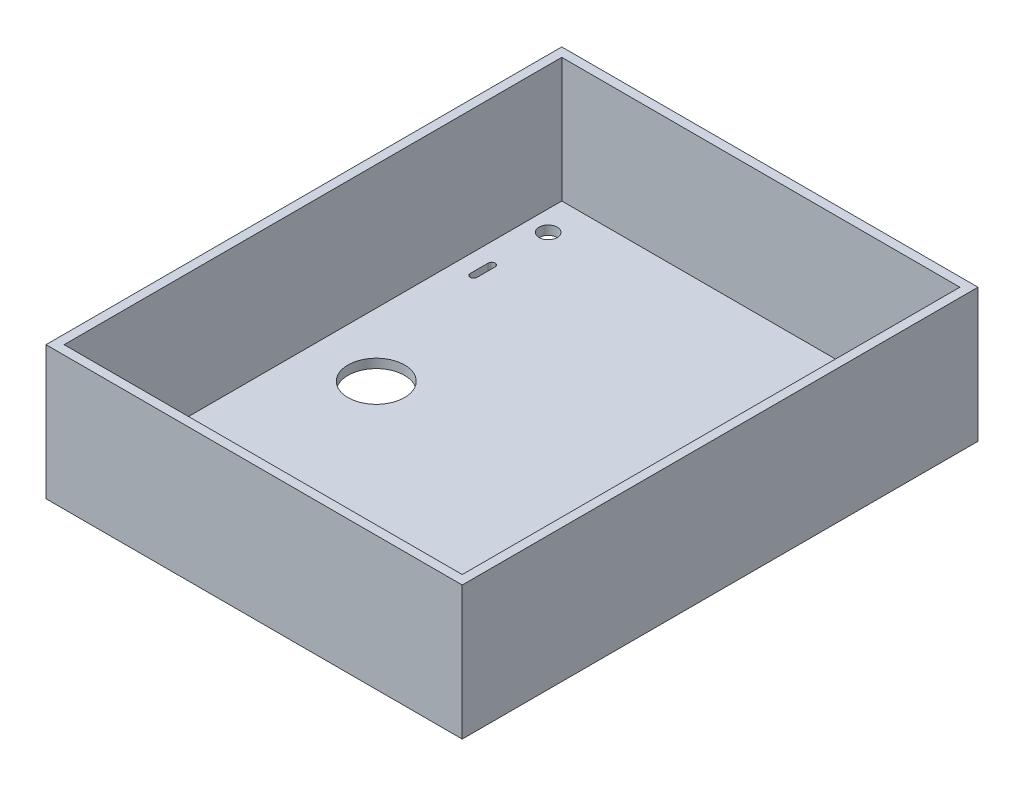
ISO-10303-21;
HEADER;
FILE_DESCRIPTION(('STEP AP214'),'2;1');
FILE_NAME('part.step','',(''),(''),'','','');
FILE_SCHEMA(('AUTOMOTIVE_DESIGN { 1 0 10303 214 1 1 1 1 }'));
ENDSEC;
DATA;
#1=APPLICATION_CONTEXT('core data for automotive mechanical design processes');
#2=APPLICATION_PROTOCOL_DEFINITION('international standard','automotive_design',2000,#1);
#3=PRODUCT_CONTEXT('',#1,'mechanical');
#4=PRODUCT('Part','Part','',(#3));
#5=PRODUCT_RELATED_PRODUCT_CATEGORY('part','',(#4));
#6=PRODUCT_DEFINITION_FORMATION('','',#4);
#7=PRODUCT_DEFINITION_CONTEXT('part definition',#1,'design');
#8=PRODUCT_DEFINITION('design','',#6,#7);
#9=PRODUCT_DEFINITION_SHAPE('','',#8);
#10=(LENGTH_UNIT() NAMED_UNIT(*) SI_UNIT(.MILLI.,.METRE.));
#11=(NAMED_UNIT(*) PLANE_ANGLE_UNIT() SI_UNIT($,.RADIAN.));
#12=(NAMED_UNIT(*) SI_UNIT($,.STERADIAN.) SOLID_ANGLE_UNIT());
#13=UNCERTAINTY_MEASURE_WITH_UNIT(LENGTH_MEASURE(1.E-05),#10,'distance_accuracy_value','');
#14=(GEOMETRIC_REPRESENTATION_CONTEXT(3) GLOBAL_UNCERTAINTY_ASSIGNED_CONTEXT((#13)) GLOBAL_UNIT_ASSIGNED_CONTEXT((#10,
#11,#12)) REPRESENTATION_CONTEXT('',''));
#15=CARTESIAN_POINT('',(0.,0.,0.));
#16=DIRECTION('',(0.,0.,1.));
#17=DIRECTION('',(1.,0.,0.));
#18=AXIS2_PLACEMENT_3D('',#15,#16,#17);
#19=CARTESIAN_POINT('',(92.,59.,-114.));
#20=DIRECTION('',(-1.,0.,0.));
#21=DIRECTION('',(0.,0.,1.));
#22=AXIS2_PLACEMENT_3D('',#19,#20,#21);
#23=PLANE('',#22);
#24=DIRECTION('',(0.,0.,-1.));
#25=VECTOR('',#24,1.);
#26=CARTESIAN_POINT('',(92.,0.,-114.));
#27=LINE('',#26,#25);
#28=CARTESIAN_POINT('',(92.,0.,114.));
#29=VERTEX_POINT('',#28);
#30=CARTESIAN_POINT('',(92.,0.,-114.));
#31=VERTEX_POINT('',#30);
#32=EDGE_CURVE('E381',#29,#31,#27,.T.);
#33=ORIENTED_EDGE('',*,*,#32,.T.);
#34=DIRECTION('',(0.,-1.,0.));
#35=VECTOR('',#34,1.);
#36=CARTESIAN_POINT('',(92.,59.,-114.));
#37=LINE('',#36,#35);
#38=CARTESIAN_POINT('',(92.,59.,-114.));
#39=VERTEX_POINT('',#38);
#40=EDGE_CURVE('E11',#39,#31,#37,.T.);
#41=ORIENTED_EDGE('',*,*,#40,.F.);
#42=DIRECTION('',(0.,0.,-1.));
#43=VECTOR('',#42,1.);
#44=CARTESIAN_POINT('',(92.,59.,-114.));
#45=LINE('',#44,#43);
#46=CARTESIAN_POINT('',(92.,59.,114.));
#47=VERTEX_POINT('',#46);
#48=EDGE_CURVE('E388',#47,#39,#45,.T.);
#49=ORIENTED_EDGE('',*,*,#48,.F.);
#50=DIRECTION('',(0.,-1.,0.));
#51=VECTOR('',#50,1.);
#52=CARTESIAN_POINT('',(92.,59.,114.));
#53=LINE('',#52,#51);
#54=EDGE_CURVE('E398',#47,#29,#53,.T.);
#55=ORIENTED_EDGE('',*,*,#54,.T.);
#56=EDGE_LOOP('',(#33,#41,#49,#55));
#57=FACE_BOUND('',#56,.T.);
#58=ADVANCED_FACE('F33',(#57),#23,.F.);
#59=CARTESIAN_POINT('',(-92.,59.,-114.));
#60=DIRECTION('',(0.,0.,1.));
#61=DIRECTION('',(1.,0.,0.));
#62=AXIS2_PLACEMENT_3D('',#59,#60,#61);
#63=PLANE('',#62);
#64=DIRECTION('',(-1.,0.,0.));
#65=VECTOR('',#64,1.);
#66=CARTESIAN_POINT('',(-92.,0.,-114.));
#67=LINE('',#66,#65);
#68=CARTESIAN_POINT('',(-92.,0.,-114.));
#69=VERTEX_POINT('',#68);
#70=EDGE_CURVE('E401',#31,#69,#67,.T.);
#71=ORIENTED_EDGE('',*,*,#70,.T.);
#72=DIRECTION('',(0.,-1.,0.));
#73=VECTOR('',#72,1.);
#74=CARTESIAN_POINT('',(-92.,59.,-114.));
#75=LINE('',#74,#73);
#76=CARTESIAN_POINT('',(-92.,59.,-114.));
#77=VERTEX_POINT('',#76);
#78=EDGE_CURVE('E40',#77,#69,#75,.T.);
#79=ORIENTED_EDGE('',*,*,#78,.F.);
#80=DIRECTION('',(-1.,0.,0.));
#81=VECTOR('',#80,1.);
#82=CARTESIAN_POINT('',(-92.,59.,-114.));
#83=LINE('',#82,#81);
#84=EDGE_CURVE('E391',#39,#77,#83,.T.);
#85=ORIENTED_EDGE('',*,*,#84,.F.);
#86=ORIENTED_EDGE('',*,*,#40,.T.);
#87=EDGE_LOOP('',(#71,#79,#85,#86));
#88=FACE_BOUND('',#87,.T.);
#89=ADVANCED_FACE('F430',(#88),#63,.F.);
#90=CARTESIAN_POINT('',(-92.,59.,-114.));
#91=DIRECTION('',(1.,0.,0.));
#92=DIRECTION('',(0.,0.,-1.));
#93=AXIS2_PLACEMENT_3D('',#90,#91,#92);
#94=PLANE('',#93);
#95=DIRECTION('',(0.,0.,1.));
#96=VECTOR('',#95,1.);
#97=CARTESIAN_POINT('',(-92.,0.,-114.));
#98=LINE('',#97,#96);
#99=CARTESIAN_POINT('',(-92.,0.,114.));
#100=VERTEX_POINT('',#99);
#101=EDGE_CURVE('E403',#69,#100,#98,.T.);
#102=ORIENTED_EDGE('',*,*,#101,.T.);
#103=DIRECTION('',(0.,-1.,0.));
#104=VECTOR('',#103,1.);
#105=CARTESIAN_POINT('',(-92.,59.,114.));
#106=LINE('',#105,#104);
#107=CARTESIAN_POINT('',(-92.,59.,114.));
#108=VERTEX_POINT('',#107);
#109=EDGE_CURVE('E408',#108,#100,#106,.T.);
#110=ORIENTED_EDGE('',*,*,#109,.F.);
#111=DIRECTION('',(0.,0.,1.));
#112=VECTOR('',#111,1.);
#113=CARTESIAN_POINT('',(-92.,59.,-114.));
#114=LINE('',#113,#112);
#115=EDGE_CURVE('E394',#77,#108,#114,.T.);
#116=ORIENTED_EDGE('',*,*,#115,.F.);
#117=ORIENTED_EDGE('',*,*,#78,.T.);
#118=EDGE_LOOP('',(#102,#110,#116,#117));
#119=FACE_BOUND('',#118,.T.);
#120=ADVANCED_FACE('F415',(#119),#94,.F.);
#121=CARTESIAN_POINT('',(-92.,59.,114.));
#122=DIRECTION('',(0.,0.,-1.));
#123=DIRECTION('',(-1.,0.,0.));
#124=AXIS2_PLACEMENT_3D('',#121,#122,#123);
#125=PLANE('',#124);
#126=DIRECTION('',(1.,0.,0.));
#127=VECTOR('',#126,1.);
#128=CARTESIAN_POINT('',(-92.,0.,114.));
#129=LINE('',#128,#127);
#130=EDGE_CURVE('E392',#100,#29,#129,.T.);
#131=ORIENTED_EDGE('',*,*,#130,.T.);
#132=ORIENTED_EDGE('',*,*,#54,.F.);
#133=DIRECTION('',(1.,0.,0.));
#134=VECTOR('',#133,1.);
#135=CARTESIAN_POINT('',(-92.,59.,114.));
#136=LINE('',#135,#134);
#137=EDGE_CURVE('E396',#108,#47,#136,.T.);
#138=ORIENTED_EDGE('',*,*,#137,.F.);
#139=ORIENTED_EDGE('',*,*,#109,.T.);
#140=EDGE_LOOP('',(#131,#132,#138,#139));
#141=FACE_BOUND('',#140,.T.);
#142=ADVANCED_FACE('F423',(#141),#125,.F.);
#143=CARTESIAN_POINT('',(0.,59.,0.));
#144=DIRECTION('',(0.,1.,0.));
#145=DIRECTION('',(0.,0.,1.));
#146=AXIS2_PLACEMENT_3D('',#143,#144,#145);
#147=PLANE('',#146);
#148=DIRECTION('',(0.,0.,-1.));
#149=VECTOR('',#148,1.);
#150=CARTESIAN_POINT('',(88.,59.,-110.));
#151=LINE('',#150,#149);
#152=CARTESIAN_POINT('',(88.,59.,110.));
#153=VERTEX_POINT('',#152);
#154=CARTESIAN_POINT('',(88.,59.,-110.));
#155=VERTEX_POINT('',#154);
#156=EDGE_CURVE('E353',#153,#155,#151,.T.);
#157=ORIENTED_EDGE('',*,*,#156,.F.);
#158=DIRECTION('',(1.,0.,0.));
#159=VECTOR('',#158,1.);
#160=CARTESIAN_POINT('',(-88.,59.,110.));
#161=LINE('',#160,#159);
#162=CARTESIAN_POINT('',(-88.,59.,110.));
#163=VERTEX_POINT('',#162);
#164=EDGE_CURVE('E360',#163,#153,#161,.T.);
#165=ORIENTED_EDGE('',*,*,#164,.F.);
#166=DIRECTION('',(0.,0.,1.));
#167=VECTOR('',#166,1.);
#168=CARTESIAN_POINT('',(-88.,59.,-110.));
#169=LINE('',#168,#167);
#170=CARTESIAN_POINT('',(-88.,59.,-110.));
#171=VERTEX_POINT('',#170);
#172=EDGE_CURVE('E374',#171,#163,#169,.T.);
#173=ORIENTED_EDGE('',*,*,#172,.F.);
#174=DIRECTION('',(-1.,0.,0.));
#175=VECTOR('',#174,1.);
#176=CARTESIAN_POINT('',(-88.,59.,-110.));
#177=LINE('',#176,#175);
#178=EDGE_CURVE('E371',#155,#171,#177,.T.);
#179=ORIENTED_EDGE('',*,*,#178,.F.);
#180=EDGE_LOOP('',(#157,#165,#173,#179));
#181=FACE_BOUND('',#180,.T.);
#182=ORIENTED_EDGE('',*,*,#48,.T.);
#183=ORIENTED_EDGE('',*,*,#84,.T.);
#184=ORIENTED_EDGE('',*,*,#115,.T.);
#185=ORIENTED_EDGE('',*,*,#137,.T.);
#186=EDGE_LOOP('',(#182,#183,#184,#185));
#187=FACE_BOUND('',#186,.T.);
#188=ADVANCED_FACE('F429',(#181,#187),#147,.T.);
#189=CARTESIAN_POINT('',(0.,0.,0.));
#190=DIRECTION('',(0.,1.,0.));
#191=DIRECTION('',(0.,0.,1.));
#192=AXIS2_PLACEMENT_3D('',#189,#190,#191);
#193=PLANE('',#192);
#194=CARTESIAN_POINT('',(-60.,0.,0.));
#195=DIRECTION('',(0.,1.,0.));
#196=DIRECTION('',(0.,0.,1.));
#197=AXIS2_PLACEMENT_3D('',#194,#195,#196);
#198=CIRCLE('',#197,12.5);
#199=CARTESIAN_POINT('',(-60.,0.,12.5));
#200=VERTEX_POINT('',#199);
#201=EDGE_CURVE('E287',#200,#200,#198,.T.);
#202=ORIENTED_EDGE('',*,*,#201,.T.);
#203=EDGE_LOOP('',(#202));
#204=FACE_BOUND('',#203,.T.);
#205=CARTESIAN_POINT('',(0.,0.,80.));
#206=DIRECTION('',(0.,1.,0.));
#207=DIRECTION('',(0.,0.,1.));
#208=AXIS2_PLACEMENT_3D('',#205,#206,#207);
#209=CIRCLE('',#208,12.5);
#210=CARTESIAN_POINT('',(0.,0.,92.5));
#211=VERTEX_POINT('',#210);
#212=EDGE_CURVE('E555',#211,#211,#209,.T.);
#213=ORIENTED_EDGE('',*,*,#212,.T.);
#214=EDGE_LOOP('',(#213));
#215=FACE_BOUND('',#214,.T.);
#216=CARTESIAN_POINT('',(79.,0.,-95.));
#217=DIRECTION('',(0.,1.,0.));
#218=DIRECTION('',(0.,0.,1.));
#219=AXIS2_PLACEMENT_3D('',#216,#217,#218);
#220=CIRCLE('',#219,4.00000000000001);
#221=CARTESIAN_POINT('',(79.,0.,-91.));
#222=VERTEX_POINT('',#221);
#223=EDGE_CURVE('E317',#222,#222,#220,.T.);
#224=ORIENTED_EDGE('',*,*,#223,.T.);
#225=EDGE_LOOP('',(#224));
#226=FACE_BOUND('',#225,.T.);
#227=DIRECTION('',(0.,0.,-1.));
#228=VECTOR('',#227,1.);
#229=CARTESIAN_POINT('',(-77.5,0.,-70.));
#230=LINE('',#229,#228);
#231=CARTESIAN_POINT('',(-77.5,0.,-62.));
#232=VERTEX_POINT('',#231);
#233=CARTESIAN_POINT('',(-77.5,0.,-70.));
#234=VERTEX_POINT('',#233);
#235=EDGE_CURVE('E310',#232,#234,#230,.T.);
#236=ORIENTED_EDGE('',*,*,#235,.T.);
#237=CARTESIAN_POINT('',(-79.,0.,-70.));
#238=DIRECTION('',(0.,1.,0.));
#239=DIRECTION('',(0.,0.,1.));
#240=AXIS2_PLACEMENT_3D('',#237,#238,#239);
#241=CIRCLE('',#240,1.50000000000003);
#242=CARTESIAN_POINT('',(-80.5,0.,-70.));
#243=VERTEX_POINT('',#242);
#244=EDGE_CURVE('E302',#234,#243,#241,.T.);
#245=ORIENTED_EDGE('',*,*,#244,.T.);
#246=DIRECTION('',(0.,0.,1.));
#247=VECTOR('',#246,1.);
#248=CARTESIAN_POINT('',(-80.5,0.,-70.));
#249=LINE('',#248,#247);
#250=CARTESIAN_POINT('',(-80.5,0.,-62.));
#251=VERTEX_POINT('',#250);
#252=EDGE_CURVE('E305',#243,#251,#249,.T.);
#253=ORIENTED_EDGE('',*,*,#252,.T.);
#254=CARTESIAN_POINT('',(-79.,0.,-62.));
#255=DIRECTION('',(0.,1.,0.));
#256=DIRECTION('',(0.,0.,1.));
#257=AXIS2_PLACEMENT_3D('',#254,#255,#256);
#258=CIRCLE('',#257,1.50000000000003);
#259=EDGE_CURVE('E47',#251,#232,#258,.T.);
#260=ORIENTED_EDGE('',*,*,#259,.T.);
#261=EDGE_LOOP('',(#236,#245,#253,#260));
#262=FACE_BOUND('',#261,.T.);
#263=CARTESIAN_POINT('',(79.,0.,95.));
#264=DIRECTION('',(0.,1.,0.));
#265=DIRECTION('',(0.,0.,1.));
#266=AXIS2_PLACEMENT_3D('',#263,#264,#265);
#267=CIRCLE('',#266,4.00000000000001);
#268=CARTESIAN_POINT('',(79.,0.,99.));
#269=VERTEX_POINT('',#268);
#270=EDGE_CURVE('E345',#269,#269,#267,.T.);
#271=ORIENTED_EDGE('',*,*,#270,.T.);
#272=EDGE_LOOP('',(#271));
#273=FACE_BOUND('',#272,.T.);
#274=CARTESIAN_POINT('',(-79.,0.,-95.));
#275=DIRECTION('',(0.,1.,0.));
#276=DIRECTION('',(0.,0.,1.));
#277=AXIS2_PLACEMENT_3D('',#274,#275,#276);
#278=CIRCLE('',#277,4.00000000000001);
#279=CARTESIAN_POINT('',(-79.,0.,-91.));
#280=VERTEX_POINT('',#279);
#281=EDGE_CURVE('E338',#280,#280,#278,.T.);
#282=ORIENTED_EDGE('',*,*,#281,.T.);
#283=EDGE_LOOP('',(#282));
#284=FACE_BOUND('',#283,.T.);
#285=DIRECTION('',(0.,0.,-1.));
#286=VECTOR('',#285,1.);
#287=CARTESIAN_POINT('',(-77.5,0.,62.));
#288=LINE('',#287,#286);
#289=CARTESIAN_POINT('',(-77.5,0.,70.));
#290=VERTEX_POINT('',#289);
#291=CARTESIAN_POINT('',(-77.5,0.,62.));
#292=VERTEX_POINT('',#291);
#293=EDGE_CURVE('E205',#290,#292,#288,.T.);
#294=ORIENTED_EDGE('',*,*,#293,.T.);
#295=CARTESIAN_POINT('',(-79.,0.,62.));
#296=DIRECTION('',(0.,1.,0.));
#297=DIRECTION('',(0.,0.,1.));
#298=AXIS2_PLACEMENT_3D('',#295,#296,#297);
#299=CIRCLE('',#298,1.50000000000002);
#300=CARTESIAN_POINT('',(-80.5,0.,62.));
#301=VERTEX_POINT('',#300);
#302=EDGE_CURVE('E197',#292,#301,#299,.T.);
#303=ORIENTED_EDGE('',*,*,#302,.T.);
#304=DIRECTION('',(0.,0.,1.));
#305=VECTOR('',#304,1.);
#306=CARTESIAN_POINT('',(-80.5,0.,62.));
#307=LINE('',#306,#305);
#308=CARTESIAN_POINT('',(-80.5,0.,70.));
#309=VERTEX_POINT('',#308);
#310=EDGE_CURVE('E208',#301,#309,#307,.T.);
#311=ORIENTED_EDGE('',*,*,#310,.T.);
#312=CARTESIAN_POINT('',(-79.,0.,70.));
#313=DIRECTION('',(0.,1.,0.));
#314=DIRECTION('',(0.,0.,1.));
#315=AXIS2_PLACEMENT_3D('',#312,#313,#314);
#316=CIRCLE('',#315,1.50000000000002);
#317=EDGE_CURVE('E55',#309,#290,#316,.T.);
#318=ORIENTED_EDGE('',*,*,#317,.T.);
#319=EDGE_LOOP('',(#294,#303,#311,#318));
#320=FACE_BOUND('',#319,.T.);
#321=DIRECTION('',(0.,0.,-1.));
#322=VECTOR('',#321,1.);
#323=CARTESIAN_POINT('',(80.5,0.,62.));
#324=LINE('',#323,#322);
#325=CARTESIAN_POINT('',(80.5,0.,70.));
#326=VERTEX_POINT('',#325);
#327=CARTESIAN_POINT('',(80.5,0.,62.));
#328=VERTEX_POINT('',#327);
#329=EDGE_CURVE('E248',#326,#328,#324,.T.);
#330=ORIENTED_EDGE('',*,*,#329,.T.);
#331=CARTESIAN_POINT('',(79.,0.,62.));
#332=DIRECTION('',(0.,1.,0.));
#333=DIRECTION('',(0.,0.,1.));
#334=AXIS2_PLACEMENT_3D('',#331,#332,#333);
#335=CIRCLE('',#334,1.49999999999999);
#336=CARTESIAN_POINT('',(77.5,0.,62.));
#337=VERTEX_POINT('',#336);
#338=EDGE_CURVE('E238',#328,#337,#335,.T.);
#339=ORIENTED_EDGE('',*,*,#338,.T.);
#340=DIRECTION('',(0.,0.,1.));
#341=VECTOR('',#340,1.);
#342=CARTESIAN_POINT('',(77.5,0.,62.));
#343=LINE('',#342,#341);
#344=CARTESIAN_POINT('',(77.5,0.,70.));
#345=VERTEX_POINT('',#344);
#346=EDGE_CURVE('E241',#337,#345,#343,.T.);
#347=ORIENTED_EDGE('',*,*,#346,.T.);
#348=CARTESIAN_POINT('',(79.,0.,70.));
#349=DIRECTION('',(0.,1.,0.));
#350=DIRECTION('',(0.,0.,1.));
#351=AXIS2_PLACEMENT_3D('',#348,#349,#350);
#352=CIRCLE('',#351,1.49999999999999);
#353=EDGE_CURVE('E245',#345,#326,#352,.T.);
#354=ORIENTED_EDGE('',*,*,#353,.T.);
#355=EDGE_LOOP('',(#330,#339,#347,#354));
#356=FACE_BOUND('',#355,.T.);
#357=DIRECTION('',(0.,0.,-1.));
#358=VECTOR('',#357,1.);
#359=CARTESIAN_POINT('',(79.,0.,-70.));
#360=LINE('',#359,#358);
#361=CARTESIAN_POINT('',(79.,0.,-62.));
#362=VERTEX_POINT('',#361);
#363=CARTESIAN_POINT('',(79.,0.,-70.));
#364=VERTEX_POINT('',#363);
#365=EDGE_CURVE('E280',#362,#364,#360,.T.);
#366=ORIENTED_EDGE('',*,*,#365,.T.);
#367=CARTESIAN_POINT('',(77.5,0.,-70.));
#368=DIRECTION('',(0.,1.,0.));
#369=DIRECTION('',(0.,0.,1.));
#370=AXIS2_PLACEMENT_3D('',#367,#368,#369);
#371=CIRCLE('',#370,1.5);
#372=CARTESIAN_POINT('',(76.,0.,-70.));
#373=VERTEX_POINT('',#372);
#374=EDGE_CURVE('E270',#364,#373,#371,.T.);
#375=ORIENTED_EDGE('',*,*,#374,.T.);
#376=DIRECTION('',(0.,0.,1.));
#377=VECTOR('',#376,1.);
#378=CARTESIAN_POINT('',(76.,0.,-70.));
#379=LINE('',#378,#377);
#380=CARTESIAN_POINT('',(76.,0.,-62.));
#381=VERTEX_POINT('',#380);
#382=EDGE_CURVE('E273',#373,#381,#379,.T.);
#383=ORIENTED_EDGE('',*,*,#382,.T.);
#384=CARTESIAN_POINT('',(77.5,0.,-62.));
#385=DIRECTION('',(0.,1.,0.));
#386=DIRECTION('',(0.,0.,1.));
#387=AXIS2_PLACEMENT_3D('',#384,#385,#386);
#388=CIRCLE('',#387,1.5);
#389=EDGE_CURVE('E277',#381,#362,#388,.T.);
#390=ORIENTED_EDGE('',*,*,#389,.T.);
#391=EDGE_LOOP('',(#366,#375,#383,#390));
#392=FACE_BOUND('',#391,.T.);
#393=CARTESIAN_POINT('',(-79.,0.,95.));
#394=DIRECTION('',(0.,1.,0.));
#395=DIRECTION('',(0.,0.,1.));
#396=AXIS2_PLACEMENT_3D('',#393,#394,#395);
#397=CIRCLE('',#396,4.00000000000001);
#398=CARTESIAN_POINT('',(-79.,0.,99.));
#399=VERTEX_POINT('',#398);
#400=EDGE_CURVE('E350',#399,#399,#397,.T.);
#401=ORIENTED_EDGE('',*,*,#400,.T.);
#402=EDGE_LOOP('',(#401));
#403=FACE_BOUND('',#402,.T.);
#404=ORIENTED_EDGE('',*,*,#32,.F.);
#405=ORIENTED_EDGE('',*,*,#130,.F.);
#406=ORIENTED_EDGE('',*,*,#101,.F.);
#407=ORIENTED_EDGE('',*,*,#70,.F.);
#408=EDGE_LOOP('',(#404,#405,#406,#407));
#409=FACE_BOUND('',#408,.T.);
#410=ADVANCED_FACE('F212',(#204,#215,#226,#262,#273,#284,#320,#356,#392,#403,#409),#193,.F.);
#411=CARTESIAN_POINT('',(88.,4.,-110.));
#412=DIRECTION('',(1.,0.,0.));
#413=DIRECTION('',(0.,0.,-1.));
#414=AXIS2_PLACEMENT_3D('',#411,#412,#413);
#415=PLANE('',#414);
#416=ORIENTED_EDGE('',*,*,#156,.T.);
#417=DIRECTION('',(0.,1.,0.));
#418=VECTOR('',#417,1.);
#419=CARTESIAN_POINT('',(88.,4.,-110.));
#420=LINE('',#419,#418);
#421=CARTESIAN_POINT('',(88.,4.,-110.));
#422=VERTEX_POINT('',#421);
#423=EDGE_CURVE('E369',#422,#155,#420,.T.);
#424=ORIENTED_EDGE('',*,*,#423,.F.);
#425=DIRECTION('',(0.,0.,-1.));
#426=VECTOR('',#425,1.);
#427=CARTESIAN_POINT('',(88.,4.,-110.));
#428=LINE('',#427,#426);
#429=CARTESIAN_POINT('',(88.,4.,110.));
#430=VERTEX_POINT('',#429);
#431=EDGE_CURVE('E356',#430,#422,#428,.T.);
#432=ORIENTED_EDGE('',*,*,#431,.F.);
#433=DIRECTION('',(0.,1.,0.));
#434=VECTOR('',#433,1.);
#435=CARTESIAN_POINT('',(88.,4.,110.));
#436=LINE('',#435,#434);
#437=EDGE_CURVE('E379',#430,#153,#436,.T.);
#438=ORIENTED_EDGE('',*,*,#437,.T.);
#439=EDGE_LOOP('',(#416,#424,#432,#438));
#440=FACE_BOUND('',#439,.T.);
#441=ADVANCED_FACE('F442',(#440),#415,.F.);
#442=CARTESIAN_POINT('',(-88.,4.,110.));
#443=DIRECTION('',(0.,0.,1.));
#444=DIRECTION('',(1.,0.,0.));
#445=AXIS2_PLACEMENT_3D('',#442,#443,#444);
#446=PLANE('',#445);
#447=ORIENTED_EDGE('',*,*,#164,.T.);
#448=ORIENTED_EDGE('',*,*,#437,.F.);
#449=DIRECTION('',(1.,0.,0.));
#450=VECTOR('',#449,1.);
#451=CARTESIAN_POINT('',(-88.,4.,110.));
#452=LINE('',#451,#450);
#453=CARTESIAN_POINT('',(-88.,4.,110.));
#454=VERTEX_POINT('',#453);
#455=EDGE_CURVE('E366',#454,#430,#452,.T.);
#456=ORIENTED_EDGE('',*,*,#455,.F.);
#457=DIRECTION('',(0.,1.,0.));
#458=VECTOR('',#457,1.);
#459=CARTESIAN_POINT('',(-88.,4.,110.));
#460=LINE('',#459,#458);
#461=EDGE_CURVE('E382',#454,#163,#460,.T.);
#462=ORIENTED_EDGE('',*,*,#461,.T.);
#463=EDGE_LOOP('',(#447,#448,#456,#462));
#464=FACE_BOUND('',#463,.T.);
#465=ADVANCED_FACE('F449',(#464),#446,.F.);
#466=CARTESIAN_POINT('',(-88.,4.,-110.));
#467=DIRECTION('',(-1.,0.,0.));
#468=DIRECTION('',(0.,0.,1.));
#469=AXIS2_PLACEMENT_3D('',#466,#467,#468);
#470=PLANE('',#469);
#471=ORIENTED_EDGE('',*,*,#172,.T.);
#472=ORIENTED_EDGE('',*,*,#461,.F.);
#473=DIRECTION('',(0.,0.,1.));
#474=VECTOR('',#473,1.);
#475=CARTESIAN_POINT('',(-88.,4.,-110.));
#476=LINE('',#475,#474);
#477=CARTESIAN_POINT('',(-88.,4.,-110.));
#478=VERTEX_POINT('',#477);
#479=EDGE_CURVE('E363',#478,#454,#476,.T.);
#480=ORIENTED_EDGE('',*,*,#479,.F.);
#481=DIRECTION('',(0.,1.,0.));
#482=VECTOR('',#481,1.);
#483=CARTESIAN_POINT('',(-88.,4.,-110.));
#484=LINE('',#483,#482);
#485=EDGE_CURVE('E384',#478,#171,#484,.T.);
#486=ORIENTED_EDGE('',*,*,#485,.T.);
#487=EDGE_LOOP('',(#471,#472,#480,#486));
#488=FACE_BOUND('',#487,.T.);
#489=ADVANCED_FACE('F455',(#488),#470,.F.);
#490=CARTESIAN_POINT('',(-88.,4.,-110.));
#491=DIRECTION('',(0.,0.,-1.));
#492=DIRECTION('',(-1.,0.,0.));
#493=AXIS2_PLACEMENT_3D('',#490,#491,#492);
#494=PLANE('',#493);
#495=ORIENTED_EDGE('',*,*,#178,.T.);
#496=ORIENTED_EDGE('',*,*,#485,.F.);
#497=DIRECTION('',(-1.,0.,0.));
#498=VECTOR('',#497,1.);
#499=CARTESIAN_POINT('',(-88.,4.,-110.));
#500=LINE('',#499,#498);
#501=EDGE_CURVE('E359',#422,#478,#500,.T.);
#502=ORIENTED_EDGE('',*,*,#501,.F.);
#503=ORIENTED_EDGE('',*,*,#423,.T.);
#504=EDGE_LOOP('',(#495,#496,#502,#503));
#505=FACE_BOUND('',#504,.T.);
#506=ADVANCED_FACE('F451',(#505),#494,.F.);
#507=CARTESIAN_POINT('',(0.,4.,0.));
#508=DIRECTION('',(0.,1.,0.));
#509=DIRECTION('',(0.,0.,1.));
#510=AXIS2_PLACEMENT_3D('',#507,#508,#509);
#511=PLANE('',#510);
#512=CARTESIAN_POINT('',(-60.,4.,0.));
#513=DIRECTION('',(0.,1.,0.));
#514=DIRECTION('',(0.,0.,1.));
#515=AXIS2_PLACEMENT_3D('',#512,#513,#514);
#516=CIRCLE('',#515,12.5);
#517=CARTESIAN_POINT('',(-60.,4.,12.5));
#518=VERTEX_POINT('',#517);
#519=EDGE_CURVE('E554',#518,#518,#516,.T.);
#520=ORIENTED_EDGE('',*,*,#519,.F.);
#521=EDGE_LOOP('',(#520));
#522=FACE_BOUND('',#521,.T.);
#523=CARTESIAN_POINT('',(0.,4.,80.));
#524=DIRECTION('',(0.,1.,0.));
#525=DIRECTION('',(0.,0.,1.));
#526=AXIS2_PLACEMENT_3D('',#523,#524,#525);
#527=CIRCLE('',#526,12.5);
#528=CARTESIAN_POINT('',(0.,4.,92.5));
#529=VERTEX_POINT('',#528);
#530=EDGE_CURVE('E221',#529,#529,#527,.T.);
#531=ORIENTED_EDGE('',*,*,#530,.F.);
#532=EDGE_LOOP('',(#531));
#533=FACE_BOUND('',#532,.T.);
#534=CARTESIAN_POINT('',(79.,4.,-95.));
#535=DIRECTION('',(0.,1.,0.));
#536=DIRECTION('',(0.,0.,1.));
#537=AXIS2_PLACEMENT_3D('',#534,#535,#536);
#538=CIRCLE('',#537,4.00000000000001);
#539=CARTESIAN_POINT('',(79.,4.,-91.));
#540=VERTEX_POINT('',#539);
#541=EDGE_CURVE('E234',#540,#540,#538,.T.);
#542=ORIENTED_EDGE('',*,*,#541,.F.);
#543=EDGE_LOOP('',(#542));
#544=FACE_BOUND('',#543,.T.);
#545=CARTESIAN_POINT('',(-79.,4.,-70.));
#546=DIRECTION('',(0.,1.,0.));
#547=DIRECTION('',(0.,0.,1.));
#548=AXIS2_PLACEMENT_3D('',#545,#546,#547);
#549=CIRCLE('',#548,1.50000000000003);
#550=CARTESIAN_POINT('',(-77.5,4.,-70.));
#551=VERTEX_POINT('',#550);
#552=CARTESIAN_POINT('',(-80.5,4.,-70.));
#553=VERTEX_POINT('',#552);
#554=EDGE_CURVE('E314',#551,#553,#549,.T.);
#555=ORIENTED_EDGE('',*,*,#554,.F.);
#556=DIRECTION('',(0.,0.,-1.));
#557=VECTOR('',#556,1.);
#558=CARTESIAN_POINT('',(-77.5,4.,-70.));
#559=LINE('',#558,#557);
#560=CARTESIAN_POINT('',(-77.5,4.,-62.));
#561=VERTEX_POINT('',#560);
#562=EDGE_CURVE('E306',#561,#551,#559,.T.);
#563=ORIENTED_EDGE('',*,*,#562,.F.);
#564=CARTESIAN_POINT('',(-79.,4.,-62.));
#565=DIRECTION('',(0.,1.,0.));
#566=DIRECTION('',(0.,0.,1.));
#567=AXIS2_PLACEMENT_3D('',#564,#565,#566);
#568=CIRCLE('',#567,1.50000000000003);
#569=CARTESIAN_POINT('',(-80.5,4.,-62.));
#570=VERTEX_POINT('',#569);
#571=EDGE_CURVE('E320',#570,#561,#568,.T.);
#572=ORIENTED_EDGE('',*,*,#571,.F.);
#573=DIRECTION('',(0.,0.,1.));
#574=VECTOR('',#573,1.);
#575=CARTESIAN_POINT('',(-80.5,4.,-70.));
#576=LINE('',#575,#574);
#577=EDGE_CURVE('E316',#553,#570,#576,.T.);
#578=ORIENTED_EDGE('',*,*,#577,.F.);
#579=EDGE_LOOP('',(#555,#563,#572,#578));
#580=FACE_BOUND('',#579,.T.);
#581=CARTESIAN_POINT('',(79.,4.,95.));
#582=DIRECTION('',(0.,1.,0.));
#583=DIRECTION('',(0.,0.,1.));
#584=AXIS2_PLACEMENT_3D('',#581,#582,#583);
#585=CIRCLE('',#584,4.00000000000001);
#586=CARTESIAN_POINT('',(79.,4.,99.));
#587=VERTEX_POINT('',#586);
#588=EDGE_CURVE('E327',#587,#587,#585,.T.);
#589=ORIENTED_EDGE('',*,*,#588,.F.);
#590=EDGE_LOOP('',(#589));
#591=FACE_BOUND('',#590,.T.);
#592=CARTESIAN_POINT('',(-79.,4.,-95.));
#593=DIRECTION('',(0.,1.,0.));
#594=DIRECTION('',(0.,0.,1.));
#595=AXIS2_PLACEMENT_3D('',#592,#593,#594);
#596=CIRCLE('',#595,4.00000000000001);
#597=CARTESIAN_POINT('',(-79.,4.,-91.));
#598=VERTEX_POINT('',#597);
#599=EDGE_CURVE('E342',#598,#598,#596,.T.);
#600=ORIENTED_EDGE('',*,*,#599,.F.);
#601=EDGE_LOOP('',(#600));
#602=FACE_BOUND('',#601,.T.);
#603=CARTESIAN_POINT('',(-79.,4.,62.));
#604=DIRECTION('',(0.,1.,0.));
#605=DIRECTION('',(0.,0.,1.));
#606=AXIS2_PLACEMENT_3D('',#603,#604,#605);
#607=CIRCLE('',#606,1.50000000000002);
#608=CARTESIAN_POINT('',(-77.5,4.,62.));
#609=VERTEX_POINT('',#608);
#610=CARTESIAN_POINT('',(-80.5,4.,62.));
#611=VERTEX_POINT('',#610);
#612=EDGE_CURVE('E200',#609,#611,#607,.T.);
#613=ORIENTED_EDGE('',*,*,#612,.F.);
#614=DIRECTION('',(0.,0.,-1.));
#615=VECTOR('',#614,1.);
#616=CARTESIAN_POINT('',(-77.5,4.,62.));
#617=LINE('',#616,#615);
#618=CARTESIAN_POINT('',(-77.5,4.,70.));
#619=VERTEX_POINT('',#618);
#620=EDGE_CURVE('E215',#619,#609,#617,.T.);
#621=ORIENTED_EDGE('',*,*,#620,.F.);
#622=CARTESIAN_POINT('',(-79.,4.,70.));
#623=DIRECTION('',(0.,1.,0.));
#624=DIRECTION('',(0.,0.,1.));
#625=AXIS2_PLACEMENT_3D('',#622,#623,#624);
#626=CIRCLE('',#625,1.50000000000002);
#627=CARTESIAN_POINT('',(-80.5,4.,70.));
#628=VERTEX_POINT('',#627);
#629=EDGE_CURVE('E218',#628,#619,#626,.T.);
#630=ORIENTED_EDGE('',*,*,#629,.F.);
#631=DIRECTION('',(0.,0.,1.));
#632=VECTOR('',#631,1.);
#633=CARTESIAN_POINT('',(-80.5,4.,62.));
#634=LINE('',#633,#632);
#635=EDGE_CURVE('E227',#611,#628,#634,.T.);
#636=ORIENTED_EDGE('',*,*,#635,.F.);
#637=EDGE_LOOP('',(#613,#621,#630,#636));
#638=FACE_BOUND('',#637,.T.);
#639=CARTESIAN_POINT('',(79.,4.,62.));
#640=DIRECTION('',(0.,1.,0.));
#641=DIRECTION('',(0.,0.,1.));
#642=AXIS2_PLACEMENT_3D('',#639,#640,#641);
#643=CIRCLE('',#642,1.49999999999999);
#644=CARTESIAN_POINT('',(80.5,4.,62.));
#645=VERTEX_POINT('',#644);
#646=CARTESIAN_POINT('',(77.5,4.,62.));
#647=VERTEX_POINT('',#646);
#648=EDGE_CURVE('E252',#645,#647,#643,.T.);
#649=ORIENTED_EDGE('',*,*,#648,.F.);
#650=DIRECTION('',(0.,0.,-1.));
#651=VECTOR('',#650,1.);
#652=CARTESIAN_POINT('',(80.5,4.,62.));
#653=LINE('',#652,#651);
#654=CARTESIAN_POINT('',(80.5,4.,70.));
#655=VERTEX_POINT('',#654);
#656=EDGE_CURVE('E242',#655,#645,#653,.T.);
#657=ORIENTED_EDGE('',*,*,#656,.F.);
#658=CARTESIAN_POINT('',(79.,4.,70.));
#659=DIRECTION('',(0.,1.,0.));
#660=DIRECTION('',(0.,0.,1.));
#661=AXIS2_PLACEMENT_3D('',#658,#659,#660);
#662=CIRCLE('',#661,1.49999999999999);
#663=CARTESIAN_POINT('',(77.5,4.,70.));
#664=VERTEX_POINT('',#663);
#665=EDGE_CURVE('E258',#664,#655,#662,.T.);
#666=ORIENTED_EDGE('',*,*,#665,.F.);
#667=DIRECTION('',(0.,0.,1.));
#668=VECTOR('',#667,1.);
#669=CARTESIAN_POINT('',(77.5,4.,62.));
#670=LINE('',#669,#668);
#671=EDGE_CURVE('E254',#647,#664,#670,.T.);
#672=ORIENTED_EDGE('',*,*,#671,.F.);
#673=EDGE_LOOP('',(#649,#657,#666,#672));
#674=FACE_BOUND('',#673,.T.);
#675=CARTESIAN_POINT('',(77.5,4.,-70.));
#676=DIRECTION('',(0.,1.,0.));
#677=DIRECTION('',(0.,0.,1.));
#678=AXIS2_PLACEMENT_3D('',#675,#676,#677);
#679=CIRCLE('',#678,1.5);
#680=CARTESIAN_POINT('',(79.,4.,-70.));
#681=VERTEX_POINT('',#680);
#682=CARTESIAN_POINT('',(76.,4.,-70.));
#683=VERTEX_POINT('',#682);
#684=EDGE_CURVE('E284',#681,#683,#679,.T.);
#685=ORIENTED_EDGE('',*,*,#684,.F.);
#686=DIRECTION('',(0.,0.,-1.));
#687=VECTOR('',#686,1.);
#688=CARTESIAN_POINT('',(79.,4.,-70.));
#689=LINE('',#688,#687);
#690=CARTESIAN_POINT('',(79.,4.,-62.));
#691=VERTEX_POINT('',#690);
#692=EDGE_CURVE('E274',#691,#681,#689,.T.);
#693=ORIENTED_EDGE('',*,*,#692,.F.);
#694=CARTESIAN_POINT('',(77.5,4.,-62.));
#695=DIRECTION('',(0.,1.,0.));
#696=DIRECTION('',(0.,0.,1.));
#697=AXIS2_PLACEMENT_3D('',#694,#695,#696);
#698=CIRCLE('',#697,1.5);
#699=CARTESIAN_POINT('',(76.,4.,-62.));
#700=VERTEX_POINT('',#699);
#701=EDGE_CURVE('E290',#700,#691,#698,.T.);
#702=ORIENTED_EDGE('',*,*,#701,.F.);
#703=DIRECTION('',(0.,0.,1.));
#704=VECTOR('',#703,1.);
#705=CARTESIAN_POINT('',(76.,4.,-70.));
#706=LINE('',#705,#704);
#707=EDGE_CURVE('E286',#683,#700,#706,.T.);
#708=ORIENTED_EDGE('',*,*,#707,.F.);
#709=EDGE_LOOP('',(#685,#693,#702,#708));
#710=FACE_BOUND('',#709,.T.);
#711=CARTESIAN_POINT('',(-79.,4.,95.));
#712=DIRECTION('',(0.,1.,0.));
#713=DIRECTION('',(0.,0.,1.));
#714=AXIS2_PLACEMENT_3D('',#711,#712,#713);
#715=CIRCLE('',#714,4.00000000000001);
#716=CARTESIAN_POINT('',(-79.,4.,99.));
#717=VERTEX_POINT('',#716);
#718=EDGE_CURVE('E341',#717,#717,#715,.T.);
#719=ORIENTED_EDGE('',*,*,#718,.F.);
#720=EDGE_LOOP('',(#719));
#721=FACE_BOUND('',#720,.T.);
#722=ORIENTED_EDGE('',*,*,#431,.T.);
#723=ORIENTED_EDGE('',*,*,#501,.T.);
#724=ORIENTED_EDGE('',*,*,#479,.T.);
#725=ORIENTED_EDGE('',*,*,#455,.T.);
#726=EDGE_LOOP('',(#722,#723,#724,#725));
#727=FACE_BOUND('',#726,.T.);
#728=ADVANCED_FACE('F454',(#522,#533,#544,#580,#591,#602,#638,#674,#710,#721,#727),#511,.T.);
#729=CARTESIAN_POINT('',(-79.,0.,95.));
#730=DIRECTION('',(0.,1.,0.));
#731=DIRECTION('',(0.,0.,1.));
#732=AXIS2_PLACEMENT_3D('',#729,#730,#731);
#733=CYLINDRICAL_SURFACE('',#732,4.00000000000001);
#734=ORIENTED_EDGE('',*,*,#400,.F.);
#735=EDGE_LOOP('',(#734));
#736=FACE_BOUND('',#735,.T.);
#737=ORIENTED_EDGE('',*,*,#718,.T.);
#738=EDGE_LOOP('',(#737));
#739=FACE_BOUND('',#738,.T.);
#740=ADVANCED_FACE('F465',(#736,#739),#733,.F.);
#741=CARTESIAN_POINT('',(77.5,0.,-70.));
#742=DIRECTION('',(0.,1.,0.));
#743=DIRECTION('',(0.,0.,1.));
#744=AXIS2_PLACEMENT_3D('',#741,#742,#743);
#745=CYLINDRICAL_SURFACE('',#744,1.5);
#746=ORIENTED_EDGE('',*,*,#684,.T.);
#747=DIRECTION('',(0.,1.,0.));
#748=VECTOR('',#747,1.);
#749=CARTESIAN_POINT('',(76.,0.,-70.));
#750=LINE('',#749,#748);
#751=EDGE_CURVE('E283',#373,#683,#750,.T.);
#752=ORIENTED_EDGE('',*,*,#751,.F.);
#753=ORIENTED_EDGE('',*,*,#374,.F.);
#754=DIRECTION('',(0.,1.,0.));
#755=VECTOR('',#754,1.);
#756=CARTESIAN_POINT('',(79.,0.,-70.));
#757=LINE('',#756,#755);
#758=EDGE_CURVE('E255',#364,#681,#757,.T.);
#759=ORIENTED_EDGE('',*,*,#758,.T.);
#760=EDGE_LOOP('',(#746,#752,#753,#759));
#761=FACE_BOUND('',#760,.T.);
#762=ADVANCED_FACE('F469',(#761),#745,.F.);
#763=CARTESIAN_POINT('',(79.,0.,-70.));
#764=DIRECTION('',(1.,0.,0.));
#765=DIRECTION('',(0.,0.,-1.));
#766=AXIS2_PLACEMENT_3D('',#763,#764,#765);
#767=PLANE('',#766);
#768=ORIENTED_EDGE('',*,*,#692,.T.);
#769=ORIENTED_EDGE('',*,*,#758,.F.);
#770=ORIENTED_EDGE('',*,*,#365,.F.);
#771=DIRECTION('',(0.,1.,0.));
#772=VECTOR('',#771,1.);
#773=CARTESIAN_POINT('',(79.,0.,-62.));
#774=LINE('',#773,#772);
#775=EDGE_CURVE('E296',#362,#691,#774,.T.);
#776=ORIENTED_EDGE('',*,*,#775,.T.);
#777=EDGE_LOOP('',(#768,#769,#770,#776));
#778=FACE_BOUND('',#777,.T.);
#779=ADVANCED_FACE('F501',(#778),#767,.F.);
#780=CARTESIAN_POINT('',(77.5,0.,-62.));
#781=DIRECTION('',(0.,1.,0.));
#782=DIRECTION('',(0.,0.,1.));
#783=AXIS2_PLACEMENT_3D('',#780,#781,#782);
#784=CYLINDRICAL_SURFACE('',#783,1.5);
#785=ORIENTED_EDGE('',*,*,#701,.T.);
#786=ORIENTED_EDGE('',*,*,#775,.F.);
#787=ORIENTED_EDGE('',*,*,#389,.F.);
#788=DIRECTION('',(0.,1.,0.));
#789=VECTOR('',#788,1.);
#790=CARTESIAN_POINT('',(76.,0.,-62.));
#791=LINE('',#790,#789);
#792=EDGE_CURVE('E298',#381,#700,#791,.T.);
#793=ORIENTED_EDGE('',*,*,#792,.T.);
#794=EDGE_LOOP('',(#785,#786,#787,#793));
#795=FACE_BOUND('',#794,.T.);
#796=ADVANCED_FACE('F507',(#795),#784,.F.);
#797=CARTESIAN_POINT('',(76.,0.,-70.));
#798=DIRECTION('',(-1.,0.,0.));
#799=DIRECTION('',(0.,0.,1.));
#800=AXIS2_PLACEMENT_3D('',#797,#798,#799);
#801=PLANE('',#800);
#802=ORIENTED_EDGE('',*,*,#707,.T.);
#803=ORIENTED_EDGE('',*,*,#792,.F.);
#804=ORIENTED_EDGE('',*,*,#382,.F.);
#805=ORIENTED_EDGE('',*,*,#751,.T.);
#806=EDGE_LOOP('',(#802,#803,#804,#805));
#807=FACE_BOUND('',#806,.T.);
#808=ADVANCED_FACE('F503',(#807),#801,.F.);
#809=CARTESIAN_POINT('',(79.,0.,62.));
#810=DIRECTION('',(0.,1.,0.));
#811=DIRECTION('',(0.,0.,1.));
#812=AXIS2_PLACEMENT_3D('',#809,#810,#811);
#813=CYLINDRICAL_SURFACE('',#812,1.49999999999999);
#814=ORIENTED_EDGE('',*,*,#648,.T.);
#815=DIRECTION('',(0.,1.,0.));
#816=VECTOR('',#815,1.);
#817=CARTESIAN_POINT('',(77.5,0.,62.));
#818=LINE('',#817,#816);
#819=EDGE_CURVE('E251',#337,#647,#818,.T.);
#820=ORIENTED_EDGE('',*,*,#819,.F.);
#821=ORIENTED_EDGE('',*,*,#338,.F.);
#822=DIRECTION('',(0.,1.,0.));
#823=VECTOR('',#822,1.);
#824=CARTESIAN_POINT('',(80.5,0.,62.));
#825=LINE('',#824,#823);
#826=EDGE_CURVE('E228',#328,#645,#825,.T.);
#827=ORIENTED_EDGE('',*,*,#826,.T.);
#828=EDGE_LOOP('',(#814,#820,#821,#827));
#829=FACE_BOUND('',#828,.T.);
#830=ADVANCED_FACE('F506',(#829),#813,.F.);
#831=CARTESIAN_POINT('',(80.5,0.,62.));
#832=DIRECTION('',(1.,0.,0.));
#833=DIRECTION('',(0.,0.,-1.));
#834=AXIS2_PLACEMENT_3D('',#831,#832,#833);
#835=PLANE('',#834);
#836=ORIENTED_EDGE('',*,*,#656,.T.);
#837=ORIENTED_EDGE('',*,*,#826,.F.);
#838=ORIENTED_EDGE('',*,*,#329,.F.);
#839=DIRECTION('',(0.,1.,0.));
#840=VECTOR('',#839,1.);
#841=CARTESIAN_POINT('',(80.5,0.,70.));
#842=LINE('',#841,#840);
#843=EDGE_CURVE('E264',#326,#655,#842,.T.);
#844=ORIENTED_EDGE('',*,*,#843,.T.);
#845=EDGE_LOOP('',(#836,#837,#838,#844));
#846=FACE_BOUND('',#845,.T.);
#847=ADVANCED_FACE('F517',(#846),#835,.F.);
#848=CARTESIAN_POINT('',(79.,0.,70.));
#849=DIRECTION('',(0.,1.,0.));
#850=DIRECTION('',(0.,0.,1.));
#851=AXIS2_PLACEMENT_3D('',#848,#849,#850);
#852=CYLINDRICAL_SURFACE('',#851,1.49999999999999);
#853=ORIENTED_EDGE('',*,*,#665,.T.);
#854=ORIENTED_EDGE('',*,*,#843,.F.);
#855=ORIENTED_EDGE('',*,*,#353,.F.);
#856=DIRECTION('',(0.,1.,0.));
#857=VECTOR('',#856,1.);
#858=CARTESIAN_POINT('',(77.5,0.,70.));
#859=LINE('',#858,#857);
#860=EDGE_CURVE('E266',#345,#664,#859,.T.);
#861=ORIENTED_EDGE('',*,*,#860,.T.);
#862=EDGE_LOOP('',(#853,#854,#855,#861));
#863=FACE_BOUND('',#862,.T.);
#864=ADVANCED_FACE('F522',(#863),#852,.F.);
#865=CARTESIAN_POINT('',(77.5,0.,62.));
#866=DIRECTION('',(-1.,0.,0.));
#867=DIRECTION('',(0.,0.,1.));
#868=AXIS2_PLACEMENT_3D('',#865,#866,#867);
#869=PLANE('',#868);
#870=ORIENTED_EDGE('',*,*,#671,.T.);
#871=ORIENTED_EDGE('',*,*,#860,.F.);
#872=ORIENTED_EDGE('',*,*,#346,.F.);
#873=ORIENTED_EDGE('',*,*,#819,.T.);
#874=EDGE_LOOP('',(#870,#871,#872,#873));
#875=FACE_BOUND('',#874,.T.);
#876=ADVANCED_FACE('F519',(#875),#869,.F.);
#877=CARTESIAN_POINT('',(-79.,0.,62.));
#878=DIRECTION('',(0.,1.,0.));
#879=DIRECTION('',(0.,0.,1.));
#880=AXIS2_PLACEMENT_3D('',#877,#878,#879);
#881=CYLINDRICAL_SURFACE('',#880,1.50000000000002);
#882=ORIENTED_EDGE('',*,*,#612,.T.);
#883=DIRECTION('',(0.,1.,0.));
#884=VECTOR('',#883,1.);
#885=CARTESIAN_POINT('',(-80.5,0.,62.));
#886=LINE('',#885,#884);
#887=EDGE_CURVE('E193',#301,#611,#886,.T.);
#888=ORIENTED_EDGE('',*,*,#887,.F.);
#889=ORIENTED_EDGE('',*,*,#302,.F.);
#890=DIRECTION('',(0.,1.,0.));
#891=VECTOR('',#890,1.);
#892=CARTESIAN_POINT('',(-77.5,0.,62.));
#893=LINE('',#892,#891);
#894=EDGE_CURVE('E232',#292,#609,#893,.T.);
#895=ORIENTED_EDGE('',*,*,#894,.T.);
#896=EDGE_LOOP('',(#882,#888,#889,#895));
#897=FACE_BOUND('',#896,.T.);
#898=ADVANCED_FACE('F195',(#897),#881,.F.);
#899=CARTESIAN_POINT('',(-77.5,0.,62.));
#900=DIRECTION('',(1.,0.,0.));
#901=DIRECTION('',(0.,0.,-1.));
#902=AXIS2_PLACEMENT_3D('',#899,#900,#901);
#903=PLANE('',#902);
#904=ORIENTED_EDGE('',*,*,#620,.T.);
#905=ORIENTED_EDGE('',*,*,#894,.F.);
#906=ORIENTED_EDGE('',*,*,#293,.F.);
#907=DIRECTION('',(0.,1.,0.));
#908=VECTOR('',#907,1.);
#909=CARTESIAN_POINT('',(-77.5,0.,70.));
#910=LINE('',#909,#908);
#911=EDGE_CURVE('E235',#290,#619,#910,.T.);
#912=ORIENTED_EDGE('',*,*,#911,.T.);
#913=EDGE_LOOP('',(#904,#905,#906,#912));
#914=FACE_BOUND('',#913,.T.);
#915=ADVANCED_FACE('F532',(#914),#903,.F.);
#916=CARTESIAN_POINT('',(-79.,0.,70.));
#917=DIRECTION('',(0.,1.,0.));
#918=DIRECTION('',(0.,0.,1.));
#919=AXIS2_PLACEMENT_3D('',#916,#917,#918);
#920=CYLINDRICAL_SURFACE('',#919,1.50000000000002);
#921=ORIENTED_EDGE('',*,*,#629,.T.);
#922=ORIENTED_EDGE('',*,*,#911,.F.);
#923=ORIENTED_EDGE('',*,*,#317,.F.);
#924=DIRECTION('',(0.,1.,0.));
#925=VECTOR('',#924,1.);
#926=CARTESIAN_POINT('',(-80.5,0.,70.));
#927=LINE('',#926,#925);
#928=EDGE_CURVE('E204',#309,#628,#927,.T.);
#929=ORIENTED_EDGE('',*,*,#928,.T.);
#930=EDGE_LOOP('',(#921,#922,#923,#929));
#931=FACE_BOUND('',#930,.T.);
#932=ADVANCED_FACE('F535',(#931),#920,.F.);
#933=CARTESIAN_POINT('',(-80.5,0.,62.));
#934=DIRECTION('',(-1.,0.,0.));
#935=DIRECTION('',(0.,0.,1.));
#936=AXIS2_PLACEMENT_3D('',#933,#934,#935);
#937=PLANE('',#936);
#938=ORIENTED_EDGE('',*,*,#635,.T.);
#939=ORIENTED_EDGE('',*,*,#928,.F.);
#940=ORIENTED_EDGE('',*,*,#310,.F.);
#941=ORIENTED_EDGE('',*,*,#887,.T.);
#942=EDGE_LOOP('',(#938,#939,#940,#941));
#943=FACE_BOUND('',#942,.T.);
#944=ADVANCED_FACE('F209',(#943),#937,.F.);
#945=CARTESIAN_POINT('',(-79.,0.,-95.));
#946=DIRECTION('',(0.,1.,0.));
#947=DIRECTION('',(0.,0.,1.));
#948=AXIS2_PLACEMENT_3D('',#945,#946,#947);
#949=CYLINDRICAL_SURFACE('',#948,4.00000000000001);
#950=ORIENTED_EDGE('',*,*,#281,.F.);
#951=EDGE_LOOP('',(#950));
#952=FACE_BOUND('',#951,.T.);
#953=ORIENTED_EDGE('',*,*,#599,.T.);
#954=EDGE_LOOP('',(#953));
#955=FACE_BOUND('',#954,.T.);
#956=ADVANCED_FACE('F475',(#952,#955),#949,.F.);
#957=CARTESIAN_POINT('',(79.,0.,95.));
#958=DIRECTION('',(0.,1.,0.));
#959=DIRECTION('',(0.,0.,1.));
#960=AXIS2_PLACEMENT_3D('',#957,#958,#959);
#961=CYLINDRICAL_SURFACE('',#960,4.00000000000001);
#962=ORIENTED_EDGE('',*,*,#270,.F.);
#963=EDGE_LOOP('',(#962));
#964=FACE_BOUND('',#963,.T.);
#965=ORIENTED_EDGE('',*,*,#588,.T.);
#966=EDGE_LOOP('',(#965));
#967=FACE_BOUND('',#966,.T.);
#968=ADVANCED_FACE('F471',(#964,#967),#961,.F.);
#969=CARTESIAN_POINT('',(-79.,0.,-70.));
#970=DIRECTION('',(0.,1.,0.));
#971=DIRECTION('',(0.,0.,1.));
#972=AXIS2_PLACEMENT_3D('',#969,#970,#971);
#973=CYLINDRICAL_SURFACE('',#972,1.50000000000003);
#974=ORIENTED_EDGE('',*,*,#554,.T.);
#975=DIRECTION('',(0.,1.,0.));
#976=VECTOR('',#975,1.);
#977=CARTESIAN_POINT('',(-80.5,0.,-70.));
#978=LINE('',#977,#976);
#979=EDGE_CURVE('E313',#243,#553,#978,.T.);
#980=ORIENTED_EDGE('',*,*,#979,.F.);
#981=ORIENTED_EDGE('',*,*,#244,.F.);
#982=DIRECTION('',(0.,1.,0.));
#983=VECTOR('',#982,1.);
#984=CARTESIAN_POINT('',(-77.5,0.,-70.));
#985=LINE('',#984,#983);
#986=EDGE_CURVE('E325',#234,#551,#985,.T.);
#987=ORIENTED_EDGE('',*,*,#986,.T.);
#988=EDGE_LOOP('',(#974,#980,#981,#987));
#989=FACE_BOUND('',#988,.T.);
#990=ADVANCED_FACE('F474',(#989),#973,.F.);
#991=CARTESIAN_POINT('',(-77.5,0.,-70.));
#992=DIRECTION('',(1.,0.,0.));
#993=DIRECTION('',(0.,0.,-1.));
#994=AXIS2_PLACEMENT_3D('',#991,#992,#993);
#995=PLANE('',#994);
#996=ORIENTED_EDGE('',*,*,#562,.T.);
#997=ORIENTED_EDGE('',*,*,#986,.F.);
#998=ORIENTED_EDGE('',*,*,#235,.F.);
#999=DIRECTION('',(0.,1.,0.));
#1000=VECTOR('',#999,1.);
#1001=CARTESIAN_POINT('',(-77.5,0.,-62.));
#1002=LINE('',#1001,#1000);
#1003=EDGE_CURVE('E328',#232,#561,#1002,.T.);
#1004=ORIENTED_EDGE('',*,*,#1003,.T.);
#1005=EDGE_LOOP('',(#996,#997,#998,#1004));
#1006=FACE_BOUND('',#1005,.T.);
#1007=ADVANCED_FACE('F488',(#1006),#995,.F.);
#1008=CARTESIAN_POINT('',(-79.,0.,-62.));
#1009=DIRECTION('',(0.,1.,0.));
#1010=DIRECTION('',(0.,0.,1.));
#1011=AXIS2_PLACEMENT_3D('',#1008,#1009,#1010);
#1012=CYLINDRICAL_SURFACE('',#1011,1.50000000000003);
#1013=ORIENTED_EDGE('',*,*,#571,.T.);
#1014=ORIENTED_EDGE('',*,*,#1003,.F.);
#1015=ORIENTED_EDGE('',*,*,#259,.F.);
#1016=DIRECTION('',(0.,1.,0.));
#1017=VECTOR('',#1016,1.);
#1018=CARTESIAN_POINT('',(-80.5,0.,-62.));
#1019=LINE('',#1018,#1017);
#1020=EDGE_CURVE('E330',#251,#570,#1019,.T.);
#1021=ORIENTED_EDGE('',*,*,#1020,.T.);
#1022=EDGE_LOOP('',(#1013,#1014,#1015,#1021));
#1023=FACE_BOUND('',#1022,.T.);
#1024=ADVANCED_FACE('F492',(#1023),#1012,.F.);
#1025=CARTESIAN_POINT('',(-80.5,0.,-70.));
#1026=DIRECTION('',(-1.,0.,0.));
#1027=DIRECTION('',(0.,0.,1.));
#1028=AXIS2_PLACEMENT_3D('',#1025,#1026,#1027);
#1029=PLANE('',#1028);
#1030=ORIENTED_EDGE('',*,*,#577,.T.);
#1031=ORIENTED_EDGE('',*,*,#1020,.F.);
#1032=ORIENTED_EDGE('',*,*,#252,.F.);
#1033=ORIENTED_EDGE('',*,*,#979,.T.);
#1034=EDGE_LOOP('',(#1030,#1031,#1032,#1033));
#1035=FACE_BOUND('',#1034,.T.);
#1036=ADVANCED_FACE('F484',(#1035),#1029,.F.);
#1037=CARTESIAN_POINT('',(79.,0.,-95.));
#1038=DIRECTION('',(0.,1.,0.));
#1039=DIRECTION('',(0.,0.,1.));
#1040=AXIS2_PLACEMENT_3D('',#1037,#1038,#1039);
#1041=CYLINDRICAL_SURFACE('',#1040,4.00000000000001);
#1042=ORIENTED_EDGE('',*,*,#223,.F.);
#1043=EDGE_LOOP('',(#1042));
#1044=FACE_BOUND('',#1043,.T.);
#1045=ORIENTED_EDGE('',*,*,#541,.T.);
#1046=EDGE_LOOP('',(#1045));
#1047=FACE_BOUND('',#1046,.T.);
#1048=ADVANCED_FACE('F480',(#1044,#1047),#1041,.F.);
#1049=CARTESIAN_POINT('',(0.,0.,80.));
#1050=DIRECTION('',(0.,1.,0.));
#1051=DIRECTION('',(0.,0.,1.));
#1052=AXIS2_PLACEMENT_3D('',#1049,#1050,#1051);
#1053=CYLINDRICAL_SURFACE('',#1052,12.5);
#1054=ORIENTED_EDGE('',*,*,#212,.F.);
#1055=EDGE_LOOP('',(#1054));
#1056=FACE_BOUND('',#1055,.T.);
#1057=ORIENTED_EDGE('',*,*,#530,.T.);
#1058=EDGE_LOOP('',(#1057));
#1059=FACE_BOUND('',#1058,.T.);
#1060=ADVANCED_FACE('F483',(#1056,#1059),#1053,.F.);
#1061=CARTESIAN_POINT('',(-60.,0.,0.));
#1062=DIRECTION('',(0.,1.,0.));
#1063=DIRECTION('',(0.,0.,1.));
#1064=AXIS2_PLACEMENT_3D('',#1061,#1062,#1063);
#1065=CYLINDRICAL_SURFACE('',#1064,12.5);
#1066=ORIENTED_EDGE('',*,*,#201,.F.);
#1067=EDGE_LOOP('',(#1066));
#1068=FACE_BOUND('',#1067,.T.);
#1069=ORIENTED_EDGE('',*,*,#519,.T.);
#1070=EDGE_LOOP('',(#1069));
#1071=FACE_BOUND('',#1070,.T.);
#1072=ADVANCED_FACE('F543',(#1068,#1071),#1065,.F.);
#1073=CLOSED_SHELL('',(#58,#89,#120,#142,#188,#410,#441,#465,#489,#506,#728,#740,#762,#779,#796,
#808,#830,#847,#864,#876,#898,#915,#932,#944,#956,#968,#990,#1007,#1024,#1036,#1048,#1060,#1072));
#1074=MANIFOLD_SOLID_BREP('B2',#1073);
#1075=ADVANCED_BREP_SHAPE_REPRESENTATION('',(#18,#1074),#14);
#1076=SHAPE_DEFINITION_REPRESENTATION(#9,#1075);
ENDSEC;
END-ISO-10303-21;
